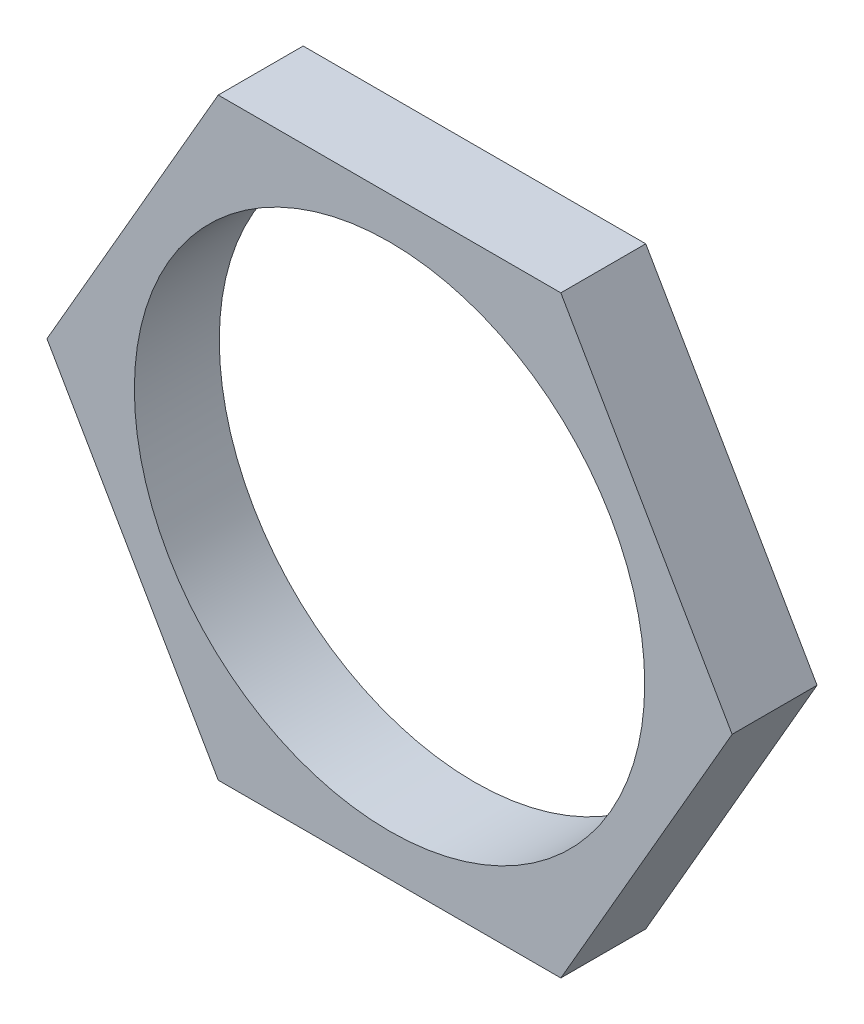
ISO-10303-21;
HEADER;
FILE_DESCRIPTION(('STEP AP214'),'2;1');
FILE_NAME('part.step','',(''),(''),'','','');
FILE_SCHEMA(('AUTOMOTIVE_DESIGN { 1 0 10303 214 1 1 1 1 }'));
ENDSEC;
DATA;
#1=APPLICATION_CONTEXT('core data for automotive mechanical design processes');
#2=APPLICATION_PROTOCOL_DEFINITION('international standard','automotive_design',2000,#1);
#3=PRODUCT_CONTEXT('',#1,'mechanical');
#4=PRODUCT('Part','Part','',(#3));
#5=PRODUCT_RELATED_PRODUCT_CATEGORY('part','',(#4));
#6=PRODUCT_DEFINITION_FORMATION('','',#4);
#7=PRODUCT_DEFINITION_CONTEXT('part definition',#1,'design');
#8=PRODUCT_DEFINITION('design','',#6,#7);
#9=PRODUCT_DEFINITION_SHAPE('','',#8);
#10=(LENGTH_UNIT() NAMED_UNIT(*) SI_UNIT(.MILLI.,.METRE.));
#11=(NAMED_UNIT(*) PLANE_ANGLE_UNIT() SI_UNIT($,.RADIAN.));
#12=(NAMED_UNIT(*) SI_UNIT($,.STERADIAN.) SOLID_ANGLE_UNIT());
#13=UNCERTAINTY_MEASURE_WITH_UNIT(LENGTH_MEASURE(1.E-05),#10,'distance_accuracy_value','');
#14=(GEOMETRIC_REPRESENTATION_CONTEXT(3) GLOBAL_UNCERTAINTY_ASSIGNED_CONTEXT((#13)) GLOBAL_UNIT_ASSIGNED_CONTEXT((#10,
#11,#12)) REPRESENTATION_CONTEXT('',''));
#15=CARTESIAN_POINT('',(0.,0.,0.));
#16=DIRECTION('',(0.,0.,1.));
#17=DIRECTION('',(1.,0.,0.));
#18=AXIS2_PLACEMENT_3D('',#15,#16,#17);
#19=CARTESIAN_POINT('',(0.,0.,0.9906));
#20=DIRECTION('',(0.,0.,1.));
#21=DIRECTION('',(1.,0.,0.));
#22=AXIS2_PLACEMENT_3D('',#19,#20,#21);
#23=PLANE('',#22);
#24=DIRECTION('',(1.,0.,0.));
#25=VECTOR('',#24,1.);
#26=CARTESIAN_POINT('',(-3.99612988819599,-6.9215,0.9906));
#27=LINE('',#26,#25);
#28=CARTESIAN_POINT('',(-3.99612988819599,-6.9215,0.9906));
#29=VERTEX_POINT('',#28);
#30=CARTESIAN_POINT('',(3.996129888196,-6.9215,0.9906));
#31=VERTEX_POINT('',#30);
#32=EDGE_CURVE('E130',#29,#31,#27,.T.);
#33=ORIENTED_EDGE('',*,*,#32,.T.);
#34=DIRECTION('',(0.5,0.866025403784439,0.));
#35=VECTOR('',#34,1.);
#36=CARTESIAN_POINT('',(3.996129888196,-6.9215,0.9906));
#37=LINE('',#36,#35);
#38=CARTESIAN_POINT('',(7.99225977639199,0.,0.9906));
#39=VERTEX_POINT('',#38);
#40=EDGE_CURVE('E88',#31,#39,#37,.T.);
#41=ORIENTED_EDGE('',*,*,#40,.T.);
#42=DIRECTION('',(-0.5,0.866025403784439,0.));
#43=VECTOR('',#42,1.);
#44=CARTESIAN_POINT('',(7.99225977639199,0.,0.9906));
#45=LINE('',#44,#43);
#46=CARTESIAN_POINT('',(3.996129888196,6.9215,0.9906));
#47=VERTEX_POINT('',#46);
#48=EDGE_CURVE('E101',#39,#47,#45,.T.);
#49=ORIENTED_EDGE('',*,*,#48,.T.);
#50=DIRECTION('',(-1.,0.,0.));
#51=VECTOR('',#50,1.);
#52=CARTESIAN_POINT('',(3.996129888196,6.9215,0.9906));
#53=LINE('',#52,#51);
#54=CARTESIAN_POINT('',(-3.996129888196,6.9215,0.9906));
#55=VERTEX_POINT('',#54);
#56=EDGE_CURVE('E95',#47,#55,#53,.T.);
#57=ORIENTED_EDGE('',*,*,#56,.T.);
#58=DIRECTION('',(-0.5,-0.866025403784438,0.));
#59=VECTOR('',#58,1.);
#60=CARTESIAN_POINT('',(-3.996129888196,6.9215,0.9906));
#61=LINE('',#60,#59);
#62=CARTESIAN_POINT('',(-7.99225977639199,0.,0.9906));
#63=VERTEX_POINT('',#62);
#64=EDGE_CURVE('E99',#55,#63,#61,.T.);
#65=ORIENTED_EDGE('',*,*,#64,.T.);
#66=DIRECTION('',(0.5,-0.866025403784439,0.));
#67=VECTOR('',#66,1.);
#68=CARTESIAN_POINT('',(-7.99225977639199,0.,0.9906));
#69=LINE('',#68,#67);
#70=EDGE_CURVE('E51',#63,#29,#69,.T.);
#71=ORIENTED_EDGE('',*,*,#70,.T.);
#72=EDGE_LOOP('',(#33,#41,#49,#57,#65,#71));
#73=FACE_BOUND('',#72,.T.);
#74=CARTESIAN_POINT('',(0.,0.,0.9906));
#75=DIRECTION('',(0.,0.,1.));
#76=DIRECTION('',(1.,0.,0.));
#77=AXIS2_PLACEMENT_3D('',#74,#75,#76);
#78=CIRCLE('',#77,5.953125);
#79=CARTESIAN_POINT('',(5.953125,0.,0.9906));
#80=VERTEX_POINT('',#79);
#81=EDGE_CURVE('E123',#80,#80,#78,.T.);
#82=ORIENTED_EDGE('',*,*,#81,.F.);
#83=EDGE_LOOP('',(#82));
#84=FACE_BOUND('',#83,.T.);
#85=ADVANCED_FACE('F34',(#73,#84),#23,.T.);
#86=CARTESIAN_POINT('',(0.,0.,-0.9906));
#87=DIRECTION('',(0.,0.,1.));
#88=DIRECTION('',(1.,0.,0.));
#89=AXIS2_PLACEMENT_3D('',#86,#87,#88);
#90=PLANE('',#89);
#91=DIRECTION('',(1.,0.,0.));
#92=VECTOR('',#91,1.);
#93=CARTESIAN_POINT('',(-3.99612988819599,-6.9215,-0.9906));
#94=LINE('',#93,#92);
#95=CARTESIAN_POINT('',(-3.99612988819599,-6.9215,-0.9906));
#96=VERTEX_POINT('',#95);
#97=CARTESIAN_POINT('',(3.996129888196,-6.9215,-0.9906));
#98=VERTEX_POINT('',#97);
#99=EDGE_CURVE('E119',#96,#98,#94,.T.);
#100=ORIENTED_EDGE('',*,*,#99,.F.);
#101=DIRECTION('',(0.5,-0.866025403784439,0.));
#102=VECTOR('',#101,1.);
#103=CARTESIAN_POINT('',(-7.99225977639199,0.,-0.9906));
#104=LINE('',#103,#102);
#105=CARTESIAN_POINT('',(-7.99225977639199,0.,-0.9906));
#106=VERTEX_POINT('',#105);
#107=EDGE_CURVE('E80',#106,#96,#104,.T.);
#108=ORIENTED_EDGE('',*,*,#107,.F.);
#109=DIRECTION('',(-0.5,-0.866025403784438,0.));
#110=VECTOR('',#109,1.);
#111=CARTESIAN_POINT('',(-3.996129888196,6.9215,-0.9906));
#112=LINE('',#111,#110);
#113=CARTESIAN_POINT('',(-3.996129888196,6.9215,-0.9906));
#114=VERTEX_POINT('',#113);
#115=EDGE_CURVE('E74',#114,#106,#112,.T.);
#116=ORIENTED_EDGE('',*,*,#115,.F.);
#117=DIRECTION('',(-1.,0.,0.));
#118=VECTOR('',#117,1.);
#119=CARTESIAN_POINT('',(3.996129888196,6.9215,-0.9906));
#120=LINE('',#119,#118);
#121=CARTESIAN_POINT('',(3.996129888196,6.9215,-0.9906));
#122=VERTEX_POINT('',#121);
#123=EDGE_CURVE('E109',#122,#114,#120,.T.);
#124=ORIENTED_EDGE('',*,*,#123,.F.);
#125=DIRECTION('',(-0.5,0.866025403784439,0.));
#126=VECTOR('',#125,1.);
#127=CARTESIAN_POINT('',(7.99225977639199,0.,-0.9906));
#128=LINE('',#127,#126);
#129=CARTESIAN_POINT('',(7.99225977639199,0.,-0.9906));
#130=VERTEX_POINT('',#129);
#131=EDGE_CURVE('E125',#130,#122,#128,.T.);
#132=ORIENTED_EDGE('',*,*,#131,.F.);
#133=DIRECTION('',(0.5,0.866025403784439,0.));
#134=VECTOR('',#133,1.);
#135=CARTESIAN_POINT('',(3.996129888196,-6.9215,-0.9906));
#136=LINE('',#135,#134);
#137=EDGE_CURVE('E122',#98,#130,#136,.T.);
#138=ORIENTED_EDGE('',*,*,#137,.F.);
#139=EDGE_LOOP('',(#100,#108,#116,#124,#132,#138));
#140=FACE_BOUND('',#139,.T.);
#141=CARTESIAN_POINT('',(0.,0.,-0.9906));
#142=DIRECTION('',(0.,0.,1.));
#143=DIRECTION('',(1.,0.,0.));
#144=AXIS2_PLACEMENT_3D('',#141,#142,#143);
#145=CIRCLE('',#144,5.953125);
#146=CARTESIAN_POINT('',(5.953125,0.,-0.9906));
#147=VERTEX_POINT('',#146);
#148=EDGE_CURVE('E223',#147,#147,#145,.T.);
#149=ORIENTED_EDGE('',*,*,#148,.T.);
#150=EDGE_LOOP('',(#149));
#151=FACE_BOUND('',#150,.T.);
#152=ADVANCED_FACE('F139',(#140,#151),#90,.F.);
#153=CARTESIAN_POINT('',(-3.99612988819599,-6.9215,0.9906));
#154=DIRECTION('',(0.,1.,0.));
#155=DIRECTION('',(-1.,0.,0.));
#156=AXIS2_PLACEMENT_3D('',#153,#154,#155);
#157=PLANE('',#156);
#158=ORIENTED_EDGE('',*,*,#99,.T.);
#159=DIRECTION('',(0.,0.,-1.));
#160=VECTOR('',#159,1.);
#161=CARTESIAN_POINT('',(3.996129888196,-6.9215,0.9906));
#162=LINE('',#161,#160);
#163=EDGE_CURVE('E11',#31,#98,#162,.T.);
#164=ORIENTED_EDGE('',*,*,#163,.F.);
#165=ORIENTED_EDGE('',*,*,#32,.F.);
#166=DIRECTION('',(0.,0.,-1.));
#167=VECTOR('',#166,1.);
#168=CARTESIAN_POINT('',(-3.99612988819599,-6.9215,0.9906));
#169=LINE('',#168,#167);
#170=EDGE_CURVE('E115',#29,#96,#169,.T.);
#171=ORIENTED_EDGE('',*,*,#170,.T.);
#172=EDGE_LOOP('',(#158,#164,#165,#171));
#173=FACE_BOUND('',#172,.T.);
#174=ADVANCED_FACE('F36',(#173),#157,.F.);
#175=CARTESIAN_POINT('',(3.996129888196,-6.9215,0.9906));
#176=DIRECTION('',(-0.866025403784439,0.5,0.));
#177=DIRECTION('',(-0.5,-0.866025403784439,0.));
#178=AXIS2_PLACEMENT_3D('',#175,#176,#177);
#179=PLANE('',#178);
#180=ORIENTED_EDGE('',*,*,#137,.T.);
#181=DIRECTION('',(0.,0.,-1.));
#182=VECTOR('',#181,1.);
#183=CARTESIAN_POINT('',(7.99225977639199,0.,0.9906));
#184=LINE('',#183,#182);
#185=EDGE_CURVE('E43',#39,#130,#184,.T.);
#186=ORIENTED_EDGE('',*,*,#185,.F.);
#187=ORIENTED_EDGE('',*,*,#40,.F.);
#188=ORIENTED_EDGE('',*,*,#163,.T.);
#189=EDGE_LOOP('',(#180,#186,#187,#188));
#190=FACE_BOUND('',#189,.T.);
#191=ADVANCED_FACE('F164',(#190),#179,.F.);
#192=CARTESIAN_POINT('',(7.99225977639199,0.,0.9906));
#193=DIRECTION('',(-0.866025403784439,-0.5,0.));
#194=DIRECTION('',(0.5,-0.866025403784439,0.));
#195=AXIS2_PLACEMENT_3D('',#192,#193,#194);
#196=PLANE('',#195);
#197=ORIENTED_EDGE('',*,*,#131,.T.);
#198=DIRECTION('',(0.,0.,-1.));
#199=VECTOR('',#198,1.);
#200=CARTESIAN_POINT('',(3.996129888196,6.9215,0.9906));
#201=LINE('',#200,#199);
#202=EDGE_CURVE('E110',#47,#122,#201,.T.);
#203=ORIENTED_EDGE('',*,*,#202,.F.);
#204=ORIENTED_EDGE('',*,*,#48,.F.);
#205=ORIENTED_EDGE('',*,*,#185,.T.);
#206=EDGE_LOOP('',(#197,#203,#204,#205));
#207=FACE_BOUND('',#206,.T.);
#208=ADVANCED_FACE('F136',(#207),#196,.F.);
#209=CARTESIAN_POINT('',(3.996129888196,6.9215,0.9906));
#210=DIRECTION('',(0.,-1.,0.));
#211=DIRECTION('',(0.,0.,-1.));
#212=AXIS2_PLACEMENT_3D('',#209,#210,#211);
#213=PLANE('',#212);
#214=ORIENTED_EDGE('',*,*,#123,.T.);
#215=DIRECTION('',(0.,0.,-1.));
#216=VECTOR('',#215,1.);
#217=CARTESIAN_POINT('',(-3.996129888196,6.9215,0.9906));
#218=LINE('',#217,#216);
#219=EDGE_CURVE('E106',#55,#114,#218,.T.);
#220=ORIENTED_EDGE('',*,*,#219,.F.);
#221=ORIENTED_EDGE('',*,*,#56,.F.);
#222=ORIENTED_EDGE('',*,*,#202,.T.);
#223=EDGE_LOOP('',(#214,#220,#221,#222));
#224=FACE_BOUND('',#223,.T.);
#225=ADVANCED_FACE('F107',(#224),#213,.F.);
#226=CARTESIAN_POINT('',(-3.996129888196,6.9215,0.9906));
#227=DIRECTION('',(0.866025403784438,-0.5,0.));
#228=DIRECTION('',(0.5,0.866025403784439,0.));
#229=AXIS2_PLACEMENT_3D('',#226,#227,#228);
#230=PLANE('',#229);
#231=ORIENTED_EDGE('',*,*,#115,.T.);
#232=DIRECTION('',(0.,0.,-1.));
#233=VECTOR('',#232,1.);
#234=CARTESIAN_POINT('',(-7.99225977639199,0.,0.9906));
#235=LINE('',#234,#233);
#236=EDGE_CURVE('E111',#63,#106,#235,.T.);
#237=ORIENTED_EDGE('',*,*,#236,.F.);
#238=ORIENTED_EDGE('',*,*,#64,.F.);
#239=ORIENTED_EDGE('',*,*,#219,.T.);
#240=EDGE_LOOP('',(#231,#237,#238,#239));
#241=FACE_BOUND('',#240,.T.);
#242=ADVANCED_FACE('F113',(#241),#230,.F.);
#243=CARTESIAN_POINT('',(-7.99225977639199,0.,0.9906));
#244=DIRECTION('',(0.866025403784439,0.5,0.));
#245=DIRECTION('',(-0.5,0.866025403784439,0.));
#246=AXIS2_PLACEMENT_3D('',#243,#244,#245);
#247=PLANE('',#246);
#248=ORIENTED_EDGE('',*,*,#107,.T.);
#249=ORIENTED_EDGE('',*,*,#170,.F.);
#250=ORIENTED_EDGE('',*,*,#70,.F.);
#251=ORIENTED_EDGE('',*,*,#236,.T.);
#252=EDGE_LOOP('',(#248,#249,#250,#251));
#253=FACE_BOUND('',#252,.T.);
#254=ADVANCED_FACE('F144',(#253),#247,.F.);
#255=CARTESIAN_POINT('',(0.,0.,0.9906));
#256=DIRECTION('',(0.,0.,-1.));
#257=DIRECTION('',(-1.,0.,0.));
#258=AXIS2_PLACEMENT_3D('',#255,#256,#257);
#259=CYLINDRICAL_SURFACE('',#258,5.953125);
#260=ORIENTED_EDGE('',*,*,#81,.T.);
#261=EDGE_LOOP('',(#260));
#262=FACE_BOUND('',#261,.T.);
#263=ORIENTED_EDGE('',*,*,#148,.F.);
#264=EDGE_LOOP('',(#263));
#265=FACE_BOUND('',#264,.T.);
#266=ADVANCED_FACE('F146',(#262,#265),#259,.F.);
#267=CLOSED_SHELL('',(#85,#152,#174,#191,#208,#225,#242,#254,#266));
#268=MANIFOLD_SOLID_BREP('B2',#267);
#269=ADVANCED_BREP_SHAPE_REPRESENTATION('',(#18,#268),#14);
#270=SHAPE_DEFINITION_REPRESENTATION(#9,#269);
ENDSEC;
END-ISO-10303-21;
